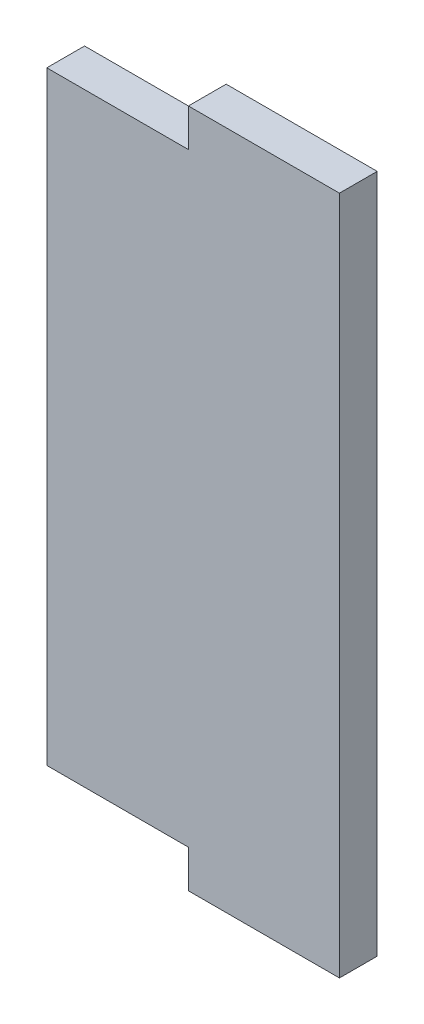
ISO-10303-21;
HEADER;
FILE_DESCRIPTION(('STEP AP214'),'2;1');
FILE_NAME('part.step','',(''),(''),'','','');
FILE_SCHEMA(('AUTOMOTIVE_DESIGN { 1 0 10303 214 1 1 1 1 }'));
ENDSEC;
DATA;
#1=APPLICATION_CONTEXT('core data for automotive mechanical design processes');
#2=APPLICATION_PROTOCOL_DEFINITION('international standard','automotive_design',2000,#1);
#3=PRODUCT_CONTEXT('',#1,'mechanical');
#4=PRODUCT('Part','Part','',(#3));
#5=PRODUCT_RELATED_PRODUCT_CATEGORY('part','',(#4));
#6=PRODUCT_DEFINITION_FORMATION('','',#4);
#7=PRODUCT_DEFINITION_CONTEXT('part definition',#1,'design');
#8=PRODUCT_DEFINITION('design','',#6,#7);
#9=PRODUCT_DEFINITION_SHAPE('','',#8);
#10=(LENGTH_UNIT() NAMED_UNIT(*) SI_UNIT(.MILLI.,.METRE.));
#11=(NAMED_UNIT(*) PLANE_ANGLE_UNIT() SI_UNIT($,.RADIAN.));
#12=(NAMED_UNIT(*) SI_UNIT($,.STERADIAN.) SOLID_ANGLE_UNIT());
#13=UNCERTAINTY_MEASURE_WITH_UNIT(LENGTH_MEASURE(1.E-05),#10,'distance_accuracy_value','');
#14=(GEOMETRIC_REPRESENTATION_CONTEXT(3) GLOBAL_UNCERTAINTY_ASSIGNED_CONTEXT((#13)) GLOBAL_UNIT_ASSIGNED_CONTEXT((#10,
#11,#12)) REPRESENTATION_CONTEXT('',''));
#15=CARTESIAN_POINT('',(0.,0.,0.));
#16=DIRECTION('',(0.,0.,1.));
#17=DIRECTION('',(1.,0.,0.));
#18=AXIS2_PLACEMENT_3D('',#15,#16,#17);
#19=CARTESIAN_POINT('',(60.325,-3.175,3.175));
#20=DIRECTION('',(0.,-1.,0.));
#21=DIRECTION('',(0.,0.,-1.));
#22=AXIS2_PLACEMENT_3D('',#19,#20,#21);
#23=PLANE('',#22);
#24=DIRECTION('',(-1.,0.,0.));
#25=VECTOR('',#24,1.);
#26=CARTESIAN_POINT('',(60.325,-3.175,0.));
#27=LINE('',#26,#25);
#28=CARTESIAN_POINT('',(60.325,-3.175,0.));
#29=VERTEX_POINT('',#28);
#30=CARTESIAN_POINT('',(47.625,-3.175,0.));
#31=VERTEX_POINT('',#30);
#32=EDGE_CURVE('E132',#29,#31,#27,.T.);
#33=ORIENTED_EDGE('',*,*,#32,.F.);
#34=DIRECTION('',(0.,0.,-1.));
#35=VECTOR('',#34,1.);
#36=CARTESIAN_POINT('',(60.325,-3.175,3.175));
#37=LINE('',#36,#35);
#38=CARTESIAN_POINT('',(60.325,-3.175,3.175));
#39=VERTEX_POINT('',#38);
#40=EDGE_CURVE('E11',#39,#29,#37,.T.);
#41=ORIENTED_EDGE('',*,*,#40,.F.);
#42=DIRECTION('',(-1.,0.,0.));
#43=VECTOR('',#42,1.);
#44=CARTESIAN_POINT('',(60.325,-3.175,3.175));
#45=LINE('',#44,#43);
#46=CARTESIAN_POINT('',(47.625,-3.175,3.175));
#47=VERTEX_POINT('',#46);
#48=EDGE_CURVE('E150',#39,#47,#45,.T.);
#49=ORIENTED_EDGE('',*,*,#48,.T.);
#50=DIRECTION('',(0.,0.,-1.));
#51=VECTOR('',#50,1.);
#52=CARTESIAN_POINT('',(47.625,-3.175,3.175));
#53=LINE('',#52,#51);
#54=EDGE_CURVE('E36',#47,#31,#53,.T.);
#55=ORIENTED_EDGE('',*,*,#54,.T.);
#56=EDGE_LOOP('',(#33,#41,#49,#55));
#57=FACE_BOUND('',#56,.T.);
#58=ADVANCED_FACE('F33',(#57),#23,.T.);
#59=CARTESIAN_POINT('',(60.325,-3.175,3.175));
#60=DIRECTION('',(-1.,0.,0.));
#61=DIRECTION('',(0.,0.,1.));
#62=AXIS2_PLACEMENT_3D('',#59,#60,#61);
#63=PLANE('',#62);
#64=DIRECTION('',(0.,1.,0.));
#65=VECTOR('',#64,1.);
#66=CARTESIAN_POINT('',(60.325,-3.175,0.));
#67=LINE('',#66,#65);
#68=CARTESIAN_POINT('',(60.325,53.975,0.));
#69=VERTEX_POINT('',#68);
#70=EDGE_CURVE('E78',#29,#69,#67,.T.);
#71=ORIENTED_EDGE('',*,*,#70,.T.);
#72=DIRECTION('',(0.,0.,-1.));
#73=VECTOR('',#72,1.);
#74=CARTESIAN_POINT('',(60.325,53.975,3.175));
#75=LINE('',#74,#73);
#76=CARTESIAN_POINT('',(60.325,53.975,3.175));
#77=VERTEX_POINT('',#76);
#78=EDGE_CURVE('E42',#77,#69,#75,.T.);
#79=ORIENTED_EDGE('',*,*,#78,.F.);
#80=DIRECTION('',(0.,1.,0.));
#81=VECTOR('',#80,1.);
#82=CARTESIAN_POINT('',(60.325,-3.175,3.175));
#83=LINE('',#82,#81);
#84=EDGE_CURVE('E110',#39,#77,#83,.T.);
#85=ORIENTED_EDGE('',*,*,#84,.F.);
#86=ORIENTED_EDGE('',*,*,#40,.T.);
#87=EDGE_LOOP('',(#71,#79,#85,#86));
#88=FACE_BOUND('',#87,.T.);
#89=ADVANCED_FACE('F187',(#88),#63,.F.);
#90=CARTESIAN_POINT('',(60.325,53.975,3.175));
#91=DIRECTION('',(0.,-1.,0.));
#92=DIRECTION('',(0.,0.,-1.));
#93=AXIS2_PLACEMENT_3D('',#90,#91,#92);
#94=PLANE('',#93);
#95=DIRECTION('',(-1.,0.,0.));
#96=VECTOR('',#95,1.);
#97=CARTESIAN_POINT('',(60.325,53.975,0.));
#98=LINE('',#97,#96);
#99=CARTESIAN_POINT('',(47.625,53.975,0.));
#100=VERTEX_POINT('',#99);
#101=EDGE_CURVE('E117',#69,#100,#98,.T.);
#102=ORIENTED_EDGE('',*,*,#101,.T.);
#103=DIRECTION('',(0.,0.,-1.));
#104=VECTOR('',#103,1.);
#105=CARTESIAN_POINT('',(47.625,53.975,3.175));
#106=LINE('',#105,#104);
#107=CARTESIAN_POINT('',(47.625,53.975,3.175));
#108=VERTEX_POINT('',#107);
#109=EDGE_CURVE('E114',#108,#100,#106,.T.);
#110=ORIENTED_EDGE('',*,*,#109,.F.);
#111=DIRECTION('',(-1.,0.,0.));
#112=VECTOR('',#111,1.);
#113=CARTESIAN_POINT('',(60.325,53.975,3.175));
#114=LINE('',#113,#112);
#115=EDGE_CURVE('E103',#77,#108,#114,.T.);
#116=ORIENTED_EDGE('',*,*,#115,.F.);
#117=ORIENTED_EDGE('',*,*,#78,.T.);
#118=EDGE_LOOP('',(#102,#110,#116,#117));
#119=FACE_BOUND('',#118,.T.);
#120=ADVANCED_FACE('F115',(#119),#94,.F.);
#121=CARTESIAN_POINT('',(47.625,53.975,3.175));
#122=DIRECTION('',(1.,0.,0.));
#123=DIRECTION('',(0.,0.,-1.));
#124=AXIS2_PLACEMENT_3D('',#121,#122,#123);
#125=PLANE('',#124);
#126=DIRECTION('',(0.,-1.,0.));
#127=VECTOR('',#126,1.);
#128=CARTESIAN_POINT('',(47.625,53.975,0.));
#129=LINE('',#128,#127);
#130=CARTESIAN_POINT('',(47.625,50.8,0.));
#131=VERTEX_POINT('',#130);
#132=EDGE_CURVE('E147',#100,#131,#129,.T.);
#133=ORIENTED_EDGE('',*,*,#132,.T.);
#134=DIRECTION('',(0.,0.,-1.));
#135=VECTOR('',#134,1.);
#136=CARTESIAN_POINT('',(47.625,50.8,3.175));
#137=LINE('',#136,#135);
#138=CARTESIAN_POINT('',(47.625,50.8,3.175));
#139=VERTEX_POINT('',#138);
#140=EDGE_CURVE('E121',#139,#131,#137,.T.);
#141=ORIENTED_EDGE('',*,*,#140,.F.);
#142=DIRECTION('',(0.,-1.,0.));
#143=VECTOR('',#142,1.);
#144=CARTESIAN_POINT('',(47.625,53.975,3.175));
#145=LINE('',#144,#143);
#146=EDGE_CURVE('E108',#108,#139,#145,.T.);
#147=ORIENTED_EDGE('',*,*,#146,.F.);
#148=ORIENTED_EDGE('',*,*,#109,.T.);
#149=EDGE_LOOP('',(#133,#141,#147,#148));
#150=FACE_BOUND('',#149,.T.);
#151=ADVANCED_FACE('F123',(#150),#125,.F.);
#152=CARTESIAN_POINT('',(35.71875,50.8,3.175));
#153=DIRECTION('',(0.,1.,0.));
#154=DIRECTION('',(0.,0.,1.));
#155=AXIS2_PLACEMENT_3D('',#152,#153,#154);
#156=PLANE('',#155);
#157=DIRECTION('',(1.,0.,0.));
#158=VECTOR('',#157,1.);
#159=CARTESIAN_POINT('',(35.71875,50.8,0.));
#160=LINE('',#159,#158);
#161=CARTESIAN_POINT('',(35.71875,50.8,0.));
#162=VERTEX_POINT('',#161);
#163=EDGE_CURVE('E144',#162,#131,#160,.T.);
#164=ORIENTED_EDGE('',*,*,#163,.F.);
#165=DIRECTION('',(0.,0.,-1.));
#166=VECTOR('',#165,1.);
#167=CARTESIAN_POINT('',(35.71875,50.8,3.175));
#168=LINE('',#167,#166);
#169=CARTESIAN_POINT('',(35.71875,50.8,3.175));
#170=VERTEX_POINT('',#169);
#171=EDGE_CURVE('E154',#170,#162,#168,.T.);
#172=ORIENTED_EDGE('',*,*,#171,.F.);
#173=DIRECTION('',(1.,0.,0.));
#174=VECTOR('',#173,1.);
#175=CARTESIAN_POINT('',(35.71875,50.8,3.175));
#176=LINE('',#175,#174);
#177=EDGE_CURVE('E125',#170,#139,#176,.T.);
#178=ORIENTED_EDGE('',*,*,#177,.T.);
#179=ORIENTED_EDGE('',*,*,#140,.T.);
#180=EDGE_LOOP('',(#164,#172,#178,#179));
#181=FACE_BOUND('',#180,.T.);
#182=ADVANCED_FACE('F167',(#181),#156,.T.);
#183=CARTESIAN_POINT('',(35.71875,0.,3.175));
#184=DIRECTION('',(-1.,0.,0.));
#185=DIRECTION('',(0.,0.,1.));
#186=AXIS2_PLACEMENT_3D('',#183,#184,#185);
#187=PLANE('',#186);
#188=DIRECTION('',(0.,1.,0.));
#189=VECTOR('',#188,1.);
#190=CARTESIAN_POINT('',(35.71875,0.,0.));
#191=LINE('',#190,#189);
#192=CARTESIAN_POINT('',(35.71875,0.,0.));
#193=VERTEX_POINT('',#192);
#194=EDGE_CURVE('E141',#193,#162,#191,.T.);
#195=ORIENTED_EDGE('',*,*,#194,.F.);
#196=DIRECTION('',(0.,0.,-1.));
#197=VECTOR('',#196,1.);
#198=CARTESIAN_POINT('',(35.71875,0.,3.175));
#199=LINE('',#198,#197);
#200=CARTESIAN_POINT('',(35.71875,0.,3.175));
#201=VERTEX_POINT('',#200);
#202=EDGE_CURVE('E156',#201,#193,#199,.T.);
#203=ORIENTED_EDGE('',*,*,#202,.F.);
#204=DIRECTION('',(0.,1.,0.));
#205=VECTOR('',#204,1.);
#206=CARTESIAN_POINT('',(35.71875,0.,3.175));
#207=LINE('',#206,#205);
#208=EDGE_CURVE('E127',#201,#170,#207,.T.);
#209=ORIENTED_EDGE('',*,*,#208,.T.);
#210=ORIENTED_EDGE('',*,*,#171,.T.);
#211=EDGE_LOOP('',(#195,#203,#209,#210));
#212=FACE_BOUND('',#211,.T.);
#213=ADVANCED_FACE('F172',(#212),#187,.T.);
#214=CARTESIAN_POINT('',(47.625,0.,3.175));
#215=DIRECTION('',(0.,-1.,0.));
#216=DIRECTION('',(0.,0.,-1.));
#217=AXIS2_PLACEMENT_3D('',#214,#215,#216);
#218=PLANE('',#217);
#219=DIRECTION('',(-1.,0.,0.));
#220=VECTOR('',#219,1.);
#221=CARTESIAN_POINT('',(47.625,0.,0.));
#222=LINE('',#221,#220);
#223=CARTESIAN_POINT('',(47.625,0.,0.));
#224=VERTEX_POINT('',#223);
#225=EDGE_CURVE('E138',#224,#193,#222,.T.);
#226=ORIENTED_EDGE('',*,*,#225,.F.);
#227=DIRECTION('',(0.,0.,-1.));
#228=VECTOR('',#227,1.);
#229=CARTESIAN_POINT('',(47.625,0.,3.175));
#230=LINE('',#229,#228);
#231=CARTESIAN_POINT('',(47.625,0.,3.175));
#232=VERTEX_POINT('',#231);
#233=EDGE_CURVE('E157',#232,#224,#230,.T.);
#234=ORIENTED_EDGE('',*,*,#233,.F.);
#235=DIRECTION('',(-1.,0.,0.));
#236=VECTOR('',#235,1.);
#237=CARTESIAN_POINT('',(47.625,0.,3.175));
#238=LINE('',#237,#236);
#239=EDGE_CURVE('E173',#232,#201,#238,.T.);
#240=ORIENTED_EDGE('',*,*,#239,.T.);
#241=ORIENTED_EDGE('',*,*,#202,.T.);
#242=EDGE_LOOP('',(#226,#234,#240,#241));
#243=FACE_BOUND('',#242,.T.);
#244=ADVANCED_FACE('F178',(#243),#218,.T.);
#245=CARTESIAN_POINT('',(47.625,0.,3.175));
#246=DIRECTION('',(1.,0.,0.));
#247=DIRECTION('',(0.,0.,-1.));
#248=AXIS2_PLACEMENT_3D('',#245,#246,#247);
#249=PLANE('',#248);
#250=DIRECTION('',(0.,-1.,0.));
#251=VECTOR('',#250,1.);
#252=CARTESIAN_POINT('',(47.625,0.,0.));
#253=LINE('',#252,#251);
#254=EDGE_CURVE('E135',#224,#31,#253,.T.);
#255=ORIENTED_EDGE('',*,*,#254,.T.);
#256=ORIENTED_EDGE('',*,*,#54,.F.);
#257=DIRECTION('',(0.,-1.,0.));
#258=VECTOR('',#257,1.);
#259=CARTESIAN_POINT('',(47.625,0.,3.175));
#260=LINE('',#259,#258);
#261=EDGE_CURVE('E88',#232,#47,#260,.T.);
#262=ORIENTED_EDGE('',*,*,#261,.F.);
#263=ORIENTED_EDGE('',*,*,#233,.T.);
#264=EDGE_LOOP('',(#255,#256,#262,#263));
#265=FACE_BOUND('',#264,.T.);
#266=ADVANCED_FACE('F160',(#265),#249,.F.);
#267=CARTESIAN_POINT('',(0.,0.,3.175));
#268=DIRECTION('',(0.,0.,1.));
#269=DIRECTION('',(1.,0.,0.));
#270=AXIS2_PLACEMENT_3D('',#267,#268,#269);
#271=PLANE('',#270);
#272=ORIENTED_EDGE('',*,*,#48,.F.);
#273=ORIENTED_EDGE('',*,*,#84,.T.);
#274=ORIENTED_EDGE('',*,*,#115,.T.);
#275=ORIENTED_EDGE('',*,*,#146,.T.);
#276=ORIENTED_EDGE('',*,*,#177,.F.);
#277=ORIENTED_EDGE('',*,*,#208,.F.);
#278=ORIENTED_EDGE('',*,*,#239,.F.);
#279=ORIENTED_EDGE('',*,*,#261,.T.);
#280=EDGE_LOOP('',(#272,#273,#274,#275,#276,#277,#278,#279));
#281=FACE_BOUND('',#280,.T.);
#282=ADVANCED_FACE('F105',(#281),#271,.T.);
#283=CARTESIAN_POINT('',(0.,0.,0.));
#284=DIRECTION('',(0.,0.,1.));
#285=DIRECTION('',(1.,0.,0.));
#286=AXIS2_PLACEMENT_3D('',#283,#284,#285);
#287=PLANE('',#286);
#288=ORIENTED_EDGE('',*,*,#32,.T.);
#289=ORIENTED_EDGE('',*,*,#254,.F.);
#290=ORIENTED_EDGE('',*,*,#225,.T.);
#291=ORIENTED_EDGE('',*,*,#194,.T.);
#292=ORIENTED_EDGE('',*,*,#163,.T.);
#293=ORIENTED_EDGE('',*,*,#132,.F.);
#294=ORIENTED_EDGE('',*,*,#101,.F.);
#295=ORIENTED_EDGE('',*,*,#70,.F.);
#296=EDGE_LOOP('',(#288,#289,#290,#291,#292,#293,#294,#295));
#297=FACE_BOUND('',#296,.T.);
#298=ADVANCED_FACE('F163',(#297),#287,.F.);
#299=CLOSED_SHELL('',(#58,#89,#120,#151,#182,#213,#244,#266,#282,#298));
#300=MANIFOLD_SOLID_BREP('B2',#299);
#301=ADVANCED_BREP_SHAPE_REPRESENTATION('',(#18,#300),#14);
#302=SHAPE_DEFINITION_REPRESENTATION(#9,#301);
ENDSEC;
END-ISO-10303-21;
